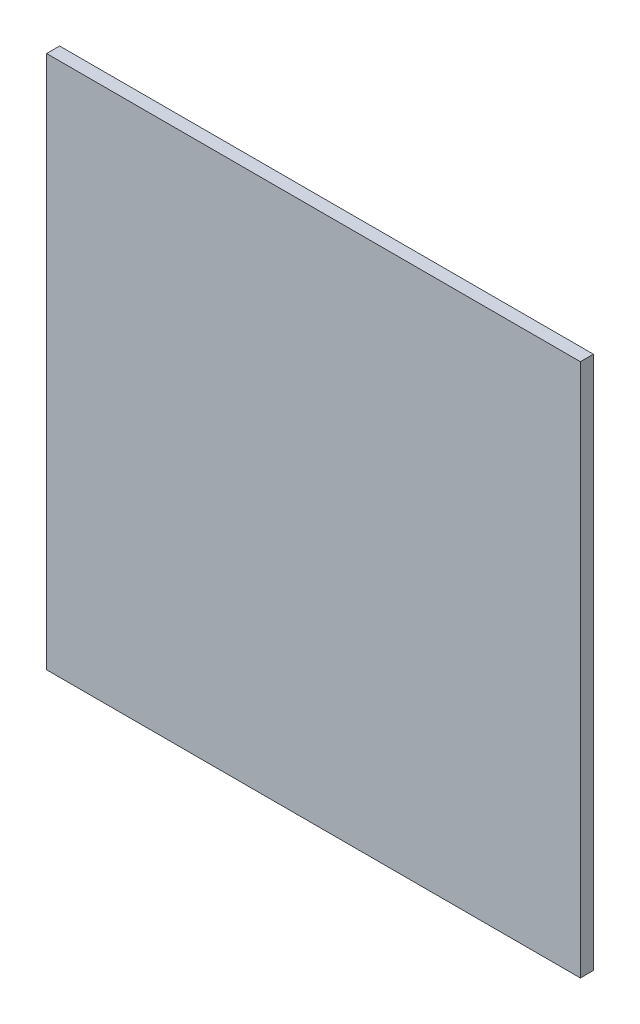
ISO-10303-21;
HEADER;
FILE_DESCRIPTION(('STEP AP214'),'2;1');
FILE_NAME('part.step','',(''),(''),'','','');
FILE_SCHEMA(('AUTOMOTIVE_DESIGN { 1 0 10303 214 1 1 1 1 }'));
ENDSEC;
DATA;
#1=APPLICATION_CONTEXT('core data for automotive mechanical design processes');
#2=APPLICATION_PROTOCOL_DEFINITION('international standard','automotive_design',2000,#1);
#3=PRODUCT_CONTEXT('',#1,'mechanical');
#4=PRODUCT('Part','Part','',(#3));
#5=PRODUCT_RELATED_PRODUCT_CATEGORY('part','',(#4));
#6=PRODUCT_DEFINITION_FORMATION('','',#4);
#7=PRODUCT_DEFINITION_CONTEXT('part definition',#1,'design');
#8=PRODUCT_DEFINITION('design','',#6,#7);
#9=PRODUCT_DEFINITION_SHAPE('','',#8);
#10=(LENGTH_UNIT() NAMED_UNIT(*) SI_UNIT(.MILLI.,.METRE.));
#11=(NAMED_UNIT(*) PLANE_ANGLE_UNIT() SI_UNIT($,.RADIAN.));
#12=(NAMED_UNIT(*) SI_UNIT($,.STERADIAN.) SOLID_ANGLE_UNIT());
#13=UNCERTAINTY_MEASURE_WITH_UNIT(LENGTH_MEASURE(1.E-05),#10,'distance_accuracy_value','');
#14=(GEOMETRIC_REPRESENTATION_CONTEXT(3) GLOBAL_UNCERTAINTY_ASSIGNED_CONTEXT((#13)) GLOBAL_UNIT_ASSIGNED_CONTEXT((#10,
#11,#12)) REPRESENTATION_CONTEXT('',''));
#15=CARTESIAN_POINT('',(0.,0.,0.));
#16=DIRECTION('',(0.,0.,1.));
#17=DIRECTION('',(1.,0.,0.));
#18=AXIS2_PLACEMENT_3D('',#15,#16,#17);
#19=CARTESIAN_POINT('',(0.,0.,0.1));
#20=DIRECTION('',(0.,0.,1.));
#21=DIRECTION('',(1.,0.,0.));
#22=AXIS2_PLACEMENT_3D('',#19,#20,#21);
#23=PLANE('',#22);
#24=DIRECTION('',(0.,1.,0.));
#25=VECTOR('',#24,1.);
#26=CARTESIAN_POINT('',(4.1,0.,0.1));
#27=LINE('',#26,#25);
#28=CARTESIAN_POINT('',(4.1,4.1,0.1));
#29=VERTEX_POINT('',#28);
#30=CARTESIAN_POINT('',(4.1,0.,0.1));
#31=VERTEX_POINT('',#30);
#32=EDGE_CURVE('E76',#29,#31,#27,.F.);
#33=ORIENTED_EDGE('',*,*,#32,.F.);
#34=DIRECTION('',(1.,0.,0.));
#35=VECTOR('',#34,1.);
#36=CARTESIAN_POINT('',(0.,4.1,0.1));
#37=LINE('',#36,#35);
#38=CARTESIAN_POINT('',(0.,4.1,0.1));
#39=VERTEX_POINT('',#38);
#40=EDGE_CURVE('E58',#39,#29,#37,.T.);
#41=ORIENTED_EDGE('',*,*,#40,.F.);
#42=DIRECTION('',(0.,1.,0.));
#43=VECTOR('',#42,1.);
#44=CARTESIAN_POINT('',(0.,0.,0.1));
#45=LINE('',#44,#43);
#46=CARTESIAN_POINT('',(0.,0.,0.1));
#47=VERTEX_POINT('',#46);
#48=EDGE_CURVE('E20',#39,#47,#45,.F.);
#49=ORIENTED_EDGE('',*,*,#48,.T.);
#50=DIRECTION('',(1.,0.,0.));
#51=VECTOR('',#50,1.);
#52=CARTESIAN_POINT('',(0.,0.,0.1));
#53=LINE('',#52,#51);
#54=EDGE_CURVE('E55',#47,#31,#53,.T.);
#55=ORIENTED_EDGE('',*,*,#54,.T.);
#56=EDGE_LOOP('',(#33,#41,#49,#55));
#57=FACE_BOUND('',#56,.T.);
#58=ADVANCED_FACE('F17',(#57),#23,.T.);
#59=CARTESIAN_POINT('',(0.,0.,0.));
#60=DIRECTION('',(1.,0.,0.));
#61=DIRECTION('',(0.,0.,-1.));
#62=AXIS2_PLACEMENT_3D('',#59,#60,#61);
#63=PLANE('',#62);
#64=DIRECTION('',(0.,0.,1.));
#65=VECTOR('',#64,1.);
#66=CARTESIAN_POINT('',(0.,4.1,0.));
#67=LINE('',#66,#65);
#68=CARTESIAN_POINT('',(0.,4.1,0.));
#69=VERTEX_POINT('',#68);
#70=EDGE_CURVE('E78',#69,#39,#67,.T.);
#71=ORIENTED_EDGE('',*,*,#70,.F.);
#72=DIRECTION('',(0.,1.,0.));
#73=VECTOR('',#72,1.);
#74=CARTESIAN_POINT('',(0.,0.,0.));
#75=LINE('',#74,#73);
#76=CARTESIAN_POINT('',(0.,0.,0.));
#77=VERTEX_POINT('',#76);
#78=EDGE_CURVE('E73',#69,#77,#75,.F.);
#79=ORIENTED_EDGE('',*,*,#78,.T.);
#80=DIRECTION('',(0.,0.,1.));
#81=VECTOR('',#80,1.);
#82=CARTESIAN_POINT('',(0.,0.,0.));
#83=LINE('',#82,#81);
#84=EDGE_CURVE('E63',#77,#47,#83,.T.);
#85=ORIENTED_EDGE('',*,*,#84,.T.);
#86=ORIENTED_EDGE('',*,*,#48,.F.);
#87=EDGE_LOOP('',(#71,#79,#85,#86));
#88=FACE_BOUND('',#87,.T.);
#89=ADVANCED_FACE('F72',(#88),#63,.F.);
#90=CARTESIAN_POINT('',(0.,0.,0.));
#91=DIRECTION('',(0.,1.,0.));
#92=DIRECTION('',(0.,0.,1.));
#93=AXIS2_PLACEMENT_3D('',#90,#91,#92);
#94=PLANE('',#93);
#95=ORIENTED_EDGE('',*,*,#54,.F.);
#96=ORIENTED_EDGE('',*,*,#84,.F.);
#97=DIRECTION('',(1.,0.,0.));
#98=VECTOR('',#97,1.);
#99=CARTESIAN_POINT('',(0.,0.,0.));
#100=LINE('',#99,#98);
#101=CARTESIAN_POINT('',(4.1,0.,0.));
#102=VERTEX_POINT('',#101);
#103=EDGE_CURVE('E83',#77,#102,#100,.T.);
#104=ORIENTED_EDGE('',*,*,#103,.T.);
#105=DIRECTION('',(0.,0.,-1.));
#106=VECTOR('',#105,1.);
#107=CARTESIAN_POINT('',(4.1,0.,0.));
#108=LINE('',#107,#106);
#109=EDGE_CURVE('E69',#31,#102,#108,.T.);
#110=ORIENTED_EDGE('',*,*,#109,.F.);
#111=EDGE_LOOP('',(#95,#96,#104,#110));
#112=FACE_BOUND('',#111,.T.);
#113=ADVANCED_FACE('F66',(#112),#94,.F.);
#114=CARTESIAN_POINT('',(4.1,0.,0.));
#115=DIRECTION('',(1.,0.,0.));
#116=DIRECTION('',(0.,0.,-1.));
#117=AXIS2_PLACEMENT_3D('',#114,#115,#116);
#118=PLANE('',#117);
#119=DIRECTION('',(0.,0.,1.));
#120=VECTOR('',#119,1.);
#121=CARTESIAN_POINT('',(4.1,4.1,0.));
#122=LINE('',#121,#120);
#123=CARTESIAN_POINT('',(4.1,4.1,0.));
#124=VERTEX_POINT('',#123);
#125=EDGE_CURVE('E34',#29,#124,#122,.F.);
#126=ORIENTED_EDGE('',*,*,#125,.F.);
#127=ORIENTED_EDGE('',*,*,#32,.T.);
#128=ORIENTED_EDGE('',*,*,#109,.T.);
#129=DIRECTION('',(0.,1.,0.));
#130=VECTOR('',#129,1.);
#131=CARTESIAN_POINT('',(4.1,0.,0.));
#132=LINE('',#131,#130);
#133=EDGE_CURVE('E26',#102,#124,#132,.T.);
#134=ORIENTED_EDGE('',*,*,#133,.T.);
#135=EDGE_LOOP('',(#126,#127,#128,#134));
#136=FACE_BOUND('',#135,.T.);
#137=ADVANCED_FACE('F88',(#136),#118,.T.);
#138=CARTESIAN_POINT('',(0.,4.1,0.));
#139=DIRECTION('',(0.,1.,0.));
#140=DIRECTION('',(0.,0.,1.));
#141=AXIS2_PLACEMENT_3D('',#138,#139,#140);
#142=PLANE('',#141);
#143=ORIENTED_EDGE('',*,*,#40,.T.);
#144=ORIENTED_EDGE('',*,*,#125,.T.);
#145=DIRECTION('',(1.,0.,0.));
#146=VECTOR('',#145,1.);
#147=CARTESIAN_POINT('',(0.,4.1,0.));
#148=LINE('',#147,#146);
#149=EDGE_CURVE('E11',#124,#69,#148,.F.);
#150=ORIENTED_EDGE('',*,*,#149,.T.);
#151=ORIENTED_EDGE('',*,*,#70,.T.);
#152=EDGE_LOOP('',(#143,#144,#150,#151));
#153=FACE_BOUND('',#152,.T.);
#154=ADVANCED_FACE('F91',(#153),#142,.T.);
#155=CARTESIAN_POINT('',(0.,0.,0.));
#156=DIRECTION('',(0.,0.,1.));
#157=DIRECTION('',(1.,0.,0.));
#158=AXIS2_PLACEMENT_3D('',#155,#156,#157);
#159=PLANE('',#158);
#160=ORIENTED_EDGE('',*,*,#133,.F.);
#161=ORIENTED_EDGE('',*,*,#103,.F.);
#162=ORIENTED_EDGE('',*,*,#78,.F.);
#163=ORIENTED_EDGE('',*,*,#149,.F.);
#164=EDGE_LOOP('',(#160,#161,#162,#163));
#165=FACE_BOUND('',#164,.T.);
#166=ADVANCED_FACE('F90',(#165),#159,.F.);
#167=CLOSED_SHELL('',(#58,#89,#113,#137,#154,#166));
#168=MANIFOLD_SOLID_BREP('B1',#167);
#169=ADVANCED_BREP_SHAPE_REPRESENTATION('',(#18,#168),#14);
#170=SHAPE_DEFINITION_REPRESENTATION(#9,#169);
ENDSEC;
END-ISO-10303-21;
